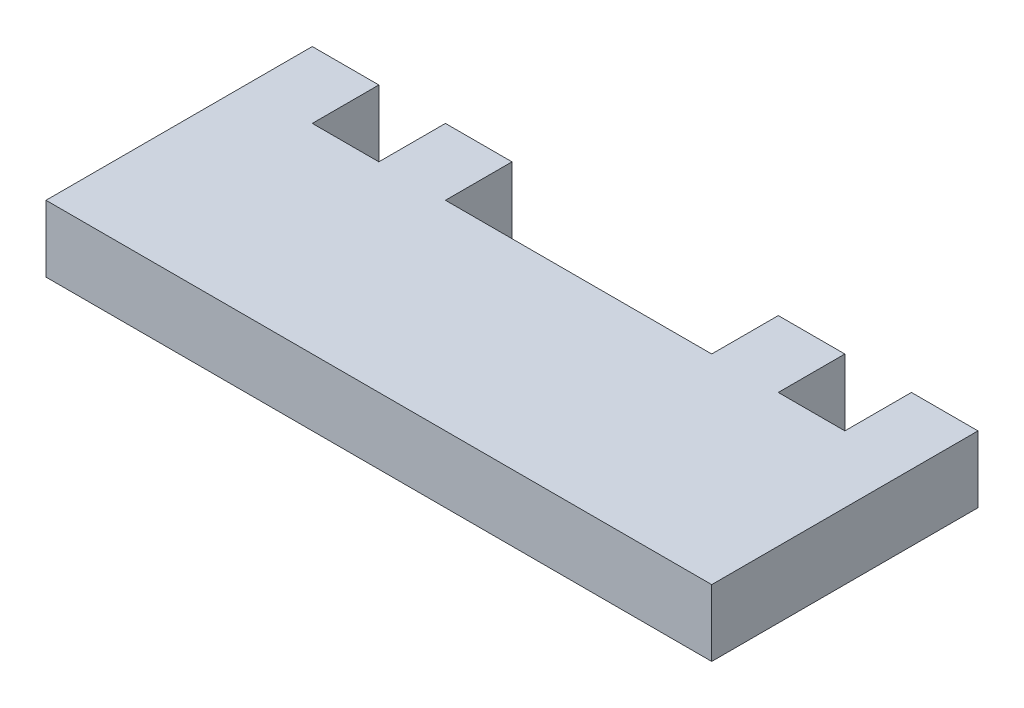
ISO-10303-21;
HEADER;
FILE_DESCRIPTION(('STEP AP214'),'2;1');
FILE_NAME('part.step','',(''),(''),'','','');
FILE_SCHEMA(('AUTOMOTIVE_DESIGN { 1 0 10303 214 1 1 1 1 }'));
ENDSEC;
DATA;
#1=APPLICATION_CONTEXT('core data for automotive mechanical design processes');
#2=APPLICATION_PROTOCOL_DEFINITION('international standard','automotive_design',2000,#1);
#3=PRODUCT_CONTEXT('',#1,'mechanical');
#4=PRODUCT('Part','Part','',(#3));
#5=PRODUCT_RELATED_PRODUCT_CATEGORY('part','',(#4));
#6=PRODUCT_DEFINITION_FORMATION('','',#4);
#7=PRODUCT_DEFINITION_CONTEXT('part definition',#1,'design');
#8=PRODUCT_DEFINITION('design','',#6,#7);
#9=PRODUCT_DEFINITION_SHAPE('','',#8);
#10=(LENGTH_UNIT() NAMED_UNIT(*) SI_UNIT(.MILLI.,.METRE.));
#11=(NAMED_UNIT(*) PLANE_ANGLE_UNIT() SI_UNIT($,.RADIAN.));
#12=(NAMED_UNIT(*) SI_UNIT($,.STERADIAN.) SOLID_ANGLE_UNIT());
#13=UNCERTAINTY_MEASURE_WITH_UNIT(LENGTH_MEASURE(1.E-05),#10,'distance_accuracy_value','');
#14=(GEOMETRIC_REPRESENTATION_CONTEXT(3) GLOBAL_UNCERTAINTY_ASSIGNED_CONTEXT((#13)) GLOBAL_UNIT_ASSIGNED_CONTEXT((#10,
#11,#12)) REPRESENTATION_CONTEXT('',''));
#15=CARTESIAN_POINT('',(0.,0.,0.));
#16=DIRECTION('',(0.,0.,1.));
#17=DIRECTION('',(1.,0.,0.));
#18=AXIS2_PLACEMENT_3D('',#15,#16,#17);
#19=CARTESIAN_POINT('',(0.,6.35,-6.34999999999999));
#20=DIRECTION('',(0.,0.,1.));
#21=DIRECTION('',(1.,0.,0.));
#22=AXIS2_PLACEMENT_3D('',#19,#20,#21);
#23=PLANE('',#22);
#24=DIRECTION('',(0.,-1.,0.));
#25=VECTOR('',#24,1.);
#26=CARTESIAN_POINT('',(-12.7,6.35,-6.34999999999999));
#27=LINE('',#26,#25);
#28=CARTESIAN_POINT('',(-12.7,6.35,-6.34999999999999));
#29=VERTEX_POINT('',#28);
#30=CARTESIAN_POINT('',(-12.7,0.,-6.34999999999999));
#31=VERTEX_POINT('',#30);
#32=EDGE_CURVE('E124',#29,#31,#27,.T.);
#33=ORIENTED_EDGE('',*,*,#32,.F.);
#34=DIRECTION('',(-1.,0.,0.));
#35=VECTOR('',#34,1.);
#36=CARTESIAN_POINT('',(0.,6.35,-6.34999999999999));
#37=LINE('',#36,#35);
#38=CARTESIAN_POINT('',(12.7,6.35,-6.34999999999999));
#39=VERTEX_POINT('',#38);
#40=EDGE_CURVE('E331',#39,#29,#37,.T.);
#41=ORIENTED_EDGE('',*,*,#40,.F.);
#42=DIRECTION('',(0.,-1.,0.));
#43=VECTOR('',#42,1.);
#44=CARTESIAN_POINT('',(12.7,6.35,-6.35000000000016));
#45=LINE('',#44,#43);
#46=CARTESIAN_POINT('',(12.7,0.,-6.34999999999999));
#47=VERTEX_POINT('',#46);
#48=EDGE_CURVE('E203',#39,#47,#45,.T.);
#49=ORIENTED_EDGE('',*,*,#48,.T.);
#50=DIRECTION('',(-1.,0.,0.));
#51=VECTOR('',#50,1.);
#52=CARTESIAN_POINT('',(0.,0.,-6.34999999999999));
#53=LINE('',#52,#51);
#54=EDGE_CURVE('E189',#47,#31,#53,.T.);
#55=ORIENTED_EDGE('',*,*,#54,.T.);
#56=EDGE_LOOP('',(#33,#41,#49,#55));
#57=FACE_BOUND('',#56,.T.);
#58=ADVANCED_FACE('F113',(#57),#23,.F.);
#59=CARTESIAN_POINT('',(-19.05,6.35,-6.34999999999999));
#60=VERTEX_POINT('',#59);
#61=CARTESIAN_POINT('',(-25.4,6.35,-6.34999999999999));
#62=VERTEX_POINT('',#61);
#63=EDGE_CURVE('E335',#60,#62,#37,.T.);
#64=ORIENTED_EDGE('',*,*,#63,.F.);
#65=DIRECTION('',(0.,-1.,0.));
#66=VECTOR('',#65,1.);
#67=CARTESIAN_POINT('',(-19.05,6.35,-6.34999999999999));
#68=LINE('',#67,#66);
#69=CARTESIAN_POINT('',(-19.05,0.,-6.34999999999999));
#70=VERTEX_POINT('',#69);
#71=EDGE_CURVE('E12',#60,#70,#68,.T.);
#72=ORIENTED_EDGE('',*,*,#71,.T.);
#73=CARTESIAN_POINT('',(-25.4,0.,-6.34999999999999));
#74=VERTEX_POINT('',#73);
#75=EDGE_CURVE('E251',#70,#74,#53,.T.);
#76=ORIENTED_EDGE('',*,*,#75,.T.);
#77=DIRECTION('',(0.,-1.,0.));
#78=VECTOR('',#77,1.);
#79=CARTESIAN_POINT('',(-25.4,6.35,-6.34999999999999));
#80=LINE('',#79,#78);
#81=EDGE_CURVE('E206',#62,#74,#80,.T.);
#82=ORIENTED_EDGE('',*,*,#81,.F.);
#83=EDGE_LOOP('',(#64,#72,#76,#82));
#84=FACE_BOUND('',#83,.T.);
#85=ADVANCED_FACE('F291',(#84),#23,.F.);
#86=CARTESIAN_POINT('',(-25.4,6.35,0.));
#87=DIRECTION('',(-1.,0.,0.));
#88=DIRECTION('',(0.,0.,1.));
#89=AXIS2_PLACEMENT_3D('',#86,#87,#88);
#90=PLANE('',#89);
#91=DIRECTION('',(0.,0.,-1.));
#92=VECTOR('',#91,1.);
#93=CARTESIAN_POINT('',(-25.4,0.,0.));
#94=LINE('',#93,#92);
#95=CARTESIAN_POINT('',(-25.4,0.,-12.7));
#96=VERTEX_POINT('',#95);
#97=EDGE_CURVE('E278',#74,#96,#94,.T.);
#98=ORIENTED_EDGE('',*,*,#97,.T.);
#99=DIRECTION('',(0.,-1.,0.));
#100=VECTOR('',#99,1.);
#101=CARTESIAN_POINT('',(-25.4,6.35,-12.7));
#102=LINE('',#101,#100);
#103=CARTESIAN_POINT('',(-25.4,6.35,-12.7));
#104=VERTEX_POINT('',#103);
#105=EDGE_CURVE('E211',#104,#96,#102,.T.);
#106=ORIENTED_EDGE('',*,*,#105,.F.);
#107=DIRECTION('',(0.,0.,-1.));
#108=VECTOR('',#107,1.);
#109=CARTESIAN_POINT('',(-25.4,6.35,0.));
#110=LINE('',#109,#108);
#111=EDGE_CURVE('E339',#62,#104,#110,.T.);
#112=ORIENTED_EDGE('',*,*,#111,.F.);
#113=ORIENTED_EDGE('',*,*,#81,.T.);
#114=EDGE_LOOP('',(#98,#106,#112,#113));
#115=FACE_BOUND('',#114,.T.);
#116=ADVANCED_FACE('F300',(#115),#90,.F.);
#117=CARTESIAN_POINT('',(0.,6.35,-12.7));
#118=DIRECTION('',(0.,0.,-1.));
#119=DIRECTION('',(-1.,0.,0.));
#120=AXIS2_PLACEMENT_3D('',#117,#118,#119);
#121=PLANE('',#120);
#122=DIRECTION('',(1.,0.,0.));
#123=VECTOR('',#122,1.);
#124=CARTESIAN_POINT('',(0.,0.,-12.7));
#125=LINE('',#124,#123);
#126=CARTESIAN_POINT('',(-31.75,0.,-12.7));
#127=VERTEX_POINT('',#126);
#128=EDGE_CURVE('E282',#127,#96,#125,.T.);
#129=ORIENTED_EDGE('',*,*,#128,.F.);
#130=DIRECTION('',(0.,-1.,0.));
#131=VECTOR('',#130,1.);
#132=CARTESIAN_POINT('',(-31.75,6.35,-12.7));
#133=LINE('',#132,#131);
#134=CARTESIAN_POINT('',(-31.75,6.35,-12.7));
#135=VERTEX_POINT('',#134);
#136=EDGE_CURVE('E219',#135,#127,#133,.T.);
#137=ORIENTED_EDGE('',*,*,#136,.F.);
#138=DIRECTION('',(1.,0.,0.));
#139=VECTOR('',#138,1.);
#140=CARTESIAN_POINT('',(0.,6.35,-12.7));
#141=LINE('',#140,#139);
#142=EDGE_CURVE('E346',#135,#104,#141,.T.);
#143=ORIENTED_EDGE('',*,*,#142,.T.);
#144=ORIENTED_EDGE('',*,*,#105,.T.);
#145=EDGE_LOOP('',(#129,#137,#143,#144));
#146=FACE_BOUND('',#145,.T.);
#147=ADVANCED_FACE('F432',(#146),#121,.T.);
#148=CARTESIAN_POINT('',(-31.75,6.35,0.));
#149=DIRECTION('',(-1.,0.,0.));
#150=DIRECTION('',(0.,0.,1.));
#151=AXIS2_PLACEMENT_3D('',#148,#149,#150);
#152=PLANE('',#151);
#153=DIRECTION('',(0.,0.,-1.));
#154=VECTOR('',#153,1.);
#155=CARTESIAN_POINT('',(-31.75,0.,0.));
#156=LINE('',#155,#154);
#157=CARTESIAN_POINT('',(-31.75,0.,12.7));
#158=VERTEX_POINT('',#157);
#159=EDGE_CURVE('E581',#158,#127,#156,.T.);
#160=ORIENTED_EDGE('',*,*,#159,.F.);
#161=DIRECTION('',(0.,-1.,0.));
#162=VECTOR('',#161,1.);
#163=CARTESIAN_POINT('',(-31.75,6.35,12.7));
#164=LINE('',#163,#162);
#165=CARTESIAN_POINT('',(-31.75,6.35,12.7));
#166=VERTEX_POINT('',#165);
#167=EDGE_CURVE('E606',#166,#158,#164,.T.);
#168=ORIENTED_EDGE('',*,*,#167,.F.);
#169=DIRECTION('',(0.,0.,-1.));
#170=VECTOR('',#169,1.);
#171=CARTESIAN_POINT('',(-31.75,6.35,0.));
#172=LINE('',#171,#170);
#173=EDGE_CURVE('E349',#166,#135,#172,.T.);
#174=ORIENTED_EDGE('',*,*,#173,.T.);
#175=ORIENTED_EDGE('',*,*,#136,.T.);
#176=EDGE_LOOP('',(#160,#168,#174,#175));
#177=FACE_BOUND('',#176,.T.);
#178=ADVANCED_FACE('F439',(#177),#152,.T.);
#179=CARTESIAN_POINT('',(0.,6.35,12.7));
#180=DIRECTION('',(0.,0.,-1.));
#181=DIRECTION('',(-1.,0.,0.));
#182=AXIS2_PLACEMENT_3D('',#179,#180,#181);
#183=PLANE('',#182);
#184=DIRECTION('',(1.,0.,0.));
#185=VECTOR('',#184,1.);
#186=CARTESIAN_POINT('',(0.,0.,12.7));
#187=LINE('',#186,#185);
#188=CARTESIAN_POINT('',(31.75,0.,12.7));
#189=VERTEX_POINT('',#188);
#190=EDGE_CURVE('E587',#158,#189,#187,.T.);
#191=ORIENTED_EDGE('',*,*,#190,.T.);
#192=DIRECTION('',(0.,-1.,0.));
#193=VECTOR('',#192,1.);
#194=CARTESIAN_POINT('',(31.75,6.35,12.7));
#195=LINE('',#194,#193);
#196=CARTESIAN_POINT('',(31.75,6.35,12.7));
#197=VERTEX_POINT('',#196);
#198=EDGE_CURVE('E602',#197,#189,#195,.T.);
#199=ORIENTED_EDGE('',*,*,#198,.F.);
#200=DIRECTION('',(1.,0.,0.));
#201=VECTOR('',#200,1.);
#202=CARTESIAN_POINT('',(0.,6.35,12.7));
#203=LINE('',#202,#201);
#204=EDGE_CURVE('E354',#166,#197,#203,.T.);
#205=ORIENTED_EDGE('',*,*,#204,.F.);
#206=ORIENTED_EDGE('',*,*,#167,.T.);
#207=EDGE_LOOP('',(#191,#199,#205,#206));
#208=FACE_BOUND('',#207,.T.);
#209=ADVANCED_FACE('F435',(#208),#183,.F.);
#210=CARTESIAN_POINT('',(31.75,6.35,0.));
#211=DIRECTION('',(-1.,0.,0.));
#212=DIRECTION('',(0.,0.,1.));
#213=AXIS2_PLACEMENT_3D('',#210,#211,#212);
#214=PLANE('',#213);
#215=DIRECTION('',(0.,0.,-1.));
#216=VECTOR('',#215,1.);
#217=CARTESIAN_POINT('',(31.75,0.,0.));
#218=LINE('',#217,#216);
#219=CARTESIAN_POINT('',(31.75,0.,-12.7));
#220=VERTEX_POINT('',#219);
#221=EDGE_CURVE('E591',#189,#220,#218,.T.);
#222=ORIENTED_EDGE('',*,*,#221,.T.);
#223=DIRECTION('',(0.,-1.,0.));
#224=VECTOR('',#223,1.);
#225=CARTESIAN_POINT('',(31.75,6.35,-12.7));
#226=LINE('',#225,#224);
#227=CARTESIAN_POINT('',(31.75,6.35,-12.7));
#228=VERTEX_POINT('',#227);
#229=EDGE_CURVE('E379',#228,#220,#226,.T.);
#230=ORIENTED_EDGE('',*,*,#229,.F.);
#231=DIRECTION('',(0.,0.,-1.));
#232=VECTOR('',#231,1.);
#233=CARTESIAN_POINT('',(31.75,6.35,0.));
#234=LINE('',#233,#232);
#235=EDGE_CURVE('E358',#197,#228,#234,.T.);
#236=ORIENTED_EDGE('',*,*,#235,.F.);
#237=ORIENTED_EDGE('',*,*,#198,.T.);
#238=EDGE_LOOP('',(#222,#230,#236,#237));
#239=FACE_BOUND('',#238,.T.);
#240=ADVANCED_FACE('F431',(#239),#214,.F.);
#241=CARTESIAN_POINT('',(25.4,0.,-12.7));
#242=VERTEX_POINT('',#241);
#243=EDGE_CURVE('E583',#242,#220,#125,.T.);
#244=ORIENTED_EDGE('',*,*,#243,.F.);
#245=DIRECTION('',(0.,-1.,0.));
#246=VECTOR('',#245,1.);
#247=CARTESIAN_POINT('',(25.4,6.35,-12.7));
#248=LINE('',#247,#246);
#249=CARTESIAN_POINT('',(25.4,6.35,-12.7));
#250=VERTEX_POINT('',#249);
#251=EDGE_CURVE('E369',#250,#242,#248,.T.);
#252=ORIENTED_EDGE('',*,*,#251,.F.);
#253=EDGE_CURVE('E350',#250,#228,#141,.T.);
#254=ORIENTED_EDGE('',*,*,#253,.T.);
#255=ORIENTED_EDGE('',*,*,#229,.T.);
#256=EDGE_LOOP('',(#244,#252,#254,#255));
#257=FACE_BOUND('',#256,.T.);
#258=ADVANCED_FACE('F377',(#257),#121,.T.);
#259=CARTESIAN_POINT('',(25.4,6.35,0.));
#260=DIRECTION('',(-1.,0.,0.));
#261=DIRECTION('',(0.,0.,1.));
#262=AXIS2_PLACEMENT_3D('',#259,#260,#261);
#263=PLANE('',#262);
#264=DIRECTION('',(0.,0.,-1.));
#265=VECTOR('',#264,1.);
#266=CARTESIAN_POINT('',(25.4,0.,0.));
#267=LINE('',#266,#265);
#268=CARTESIAN_POINT('',(25.4,0.,-6.34999999999999));
#269=VERTEX_POINT('',#268);
#270=EDGE_CURVE('E341',#269,#242,#267,.T.);
#271=ORIENTED_EDGE('',*,*,#270,.F.);
#272=DIRECTION('',(0.,-1.,0.));
#273=VECTOR('',#272,1.);
#274=CARTESIAN_POINT('',(25.4,6.35,-6.34999999999999));
#275=LINE('',#274,#273);
#276=CARTESIAN_POINT('',(25.4,6.35,-6.34999999999999));
#277=VERTEX_POINT('',#276);
#278=EDGE_CURVE('E276',#277,#269,#275,.T.);
#279=ORIENTED_EDGE('',*,*,#278,.F.);
#280=DIRECTION('',(0.,0.,-1.));
#281=VECTOR('',#280,1.);
#282=CARTESIAN_POINT('',(25.4,6.35,0.));
#283=LINE('',#282,#281);
#284=EDGE_CURVE('E361',#277,#250,#283,.T.);
#285=ORIENTED_EDGE('',*,*,#284,.T.);
#286=ORIENTED_EDGE('',*,*,#251,.T.);
#287=EDGE_LOOP('',(#271,#279,#285,#286));
#288=FACE_BOUND('',#287,.T.);
#289=ADVANCED_FACE('F426',(#288),#263,.T.);
#290=DIRECTION('',(0.,-1.,0.));
#291=VECTOR('',#290,1.);
#292=CARTESIAN_POINT('',(19.05,6.35,-6.35000000000025));
#293=LINE('',#292,#291);
#294=CARTESIAN_POINT('',(19.05,6.35,-6.34999999999999));
#295=VERTEX_POINT('',#294);
#296=CARTESIAN_POINT('',(19.05,0.,-6.34999999999999));
#297=VERTEX_POINT('',#296);
#298=EDGE_CURVE('E199',#295,#297,#293,.T.);
#299=ORIENTED_EDGE('',*,*,#298,.F.);
#300=EDGE_CURVE('E334',#277,#295,#37,.T.);
#301=ORIENTED_EDGE('',*,*,#300,.F.);
#302=ORIENTED_EDGE('',*,*,#278,.T.);
#303=EDGE_CURVE('E266',#269,#297,#53,.T.);
#304=ORIENTED_EDGE('',*,*,#303,.T.);
#305=EDGE_LOOP('',(#299,#301,#302,#304));
#306=FACE_BOUND('',#305,.T.);
#307=ADVANCED_FACE('F272',(#306),#23,.F.);
#308=CARTESIAN_POINT('',(0.,0.,0.));
#309=DIRECTION('',(0.,1.,0.));
#310=DIRECTION('',(0.,0.,1.));
#311=AXIS2_PLACEMENT_3D('',#308,#309,#310);
#312=PLANE('',#311);
#313=ORIENTED_EDGE('',*,*,#303,.F.);
#314=ORIENTED_EDGE('',*,*,#270,.T.);
#315=ORIENTED_EDGE('',*,*,#243,.T.);
#316=ORIENTED_EDGE('',*,*,#221,.F.);
#317=ORIENTED_EDGE('',*,*,#190,.F.);
#318=ORIENTED_EDGE('',*,*,#159,.T.);
#319=ORIENTED_EDGE('',*,*,#128,.T.);
#320=ORIENTED_EDGE('',*,*,#97,.F.);
#321=ORIENTED_EDGE('',*,*,#75,.F.);
#322=DIRECTION('',(0.,0.,-1.));
#323=VECTOR('',#322,1.);
#324=CARTESIAN_POINT('',(-19.05,0.,-6.34999999999999));
#325=LINE('',#324,#323);
#326=CARTESIAN_POINT('',(-19.05,0.,-12.7));
#327=VERTEX_POINT('',#326);
#328=EDGE_CURVE('E231',#70,#327,#325,.T.);
#329=ORIENTED_EDGE('',*,*,#328,.T.);
#330=DIRECTION('',(1.,0.,0.));
#331=VECTOR('',#330,1.);
#332=CARTESIAN_POINT('',(-19.05,0.,-12.7));
#333=LINE('',#332,#331);
#334=CARTESIAN_POINT('',(-12.7,0.,-12.7));
#335=VERTEX_POINT('',#334);
#336=EDGE_CURVE('E238',#327,#335,#333,.T.);
#337=ORIENTED_EDGE('',*,*,#336,.T.);
#338=DIRECTION('',(0.,0.,-1.));
#339=VECTOR('',#338,1.);
#340=CARTESIAN_POINT('',(-12.7,0.,-6.34999999999999));
#341=LINE('',#340,#339);
#342=EDGE_CURVE('E242',#31,#335,#341,.T.);
#343=ORIENTED_EDGE('',*,*,#342,.F.);
#344=ORIENTED_EDGE('',*,*,#54,.F.);
#345=DIRECTION('',(0.,0.,-1.));
#346=VECTOR('',#345,1.);
#347=CARTESIAN_POINT('',(12.7,0.,-6.35000000000016));
#348=LINE('',#347,#346);
#349=CARTESIAN_POINT('',(12.7,0.,-12.7000000000002));
#350=VERTEX_POINT('',#349);
#351=EDGE_CURVE('E173',#47,#350,#348,.T.);
#352=ORIENTED_EDGE('',*,*,#351,.T.);
#353=DIRECTION('',(-1.,0.,0.));
#354=VECTOR('',#353,1.);
#355=CARTESIAN_POINT('',(19.05,0.,-12.7000000000002));
#356=LINE('',#355,#354);
#357=CARTESIAN_POINT('',(19.05,0.,-12.7000000000002));
#358=VERTEX_POINT('',#357);
#359=EDGE_CURVE('E162',#358,#350,#356,.T.);
#360=ORIENTED_EDGE('',*,*,#359,.F.);
#361=DIRECTION('',(0.,0.,-1.));
#362=VECTOR('',#361,1.);
#363=CARTESIAN_POINT('',(19.05,0.,-6.35000000000025));
#364=LINE('',#363,#362);
#365=EDGE_CURVE('E183',#297,#358,#364,.T.);
#366=ORIENTED_EDGE('',*,*,#365,.F.);
#367=EDGE_LOOP('',(#313,#314,#315,#316,#317,#318,#319,#320,#321,#329,#337,#343,#344,#352,#360,#366));
#368=FACE_BOUND('',#367,.T.);
#369=ADVANCED_FACE('F186',(#368),#312,.F.);
#370=CARTESIAN_POINT('',(0.,6.35,0.));
#371=DIRECTION('',(0.,1.,0.));
#372=DIRECTION('',(0.,0.,1.));
#373=AXIS2_PLACEMENT_3D('',#370,#371,#372);
#374=PLANE('',#373);
#375=ORIENTED_EDGE('',*,*,#300,.T.);
#376=DIRECTION('',(0.,0.,-1.));
#377=VECTOR('',#376,1.);
#378=CARTESIAN_POINT('',(19.05,6.35,-6.35000000000025));
#379=LINE('',#378,#377);
#380=CARTESIAN_POINT('',(19.05,6.35,-12.7000000000002));
#381=VERTEX_POINT('',#380);
#382=EDGE_CURVE('E191',#295,#381,#379,.T.);
#383=ORIENTED_EDGE('',*,*,#382,.T.);
#384=DIRECTION('',(-1.,0.,0.));
#385=VECTOR('',#384,1.);
#386=CARTESIAN_POINT('',(19.05,6.35,-12.7000000000002));
#387=LINE('',#386,#385);
#388=CARTESIAN_POINT('',(12.7,6.35,-12.7000000000002));
#389=VERTEX_POINT('',#388);
#390=EDGE_CURVE('E195',#381,#389,#387,.T.);
#391=ORIENTED_EDGE('',*,*,#390,.T.);
#392=DIRECTION('',(0.,0.,-1.));
#393=VECTOR('',#392,1.);
#394=CARTESIAN_POINT('',(12.7,6.35,-6.35000000000016));
#395=LINE('',#394,#393);
#396=EDGE_CURVE('E176',#39,#389,#395,.T.);
#397=ORIENTED_EDGE('',*,*,#396,.F.);
#398=ORIENTED_EDGE('',*,*,#40,.T.);
#399=DIRECTION('',(0.,0.,-1.));
#400=VECTOR('',#399,1.);
#401=CARTESIAN_POINT('',(-12.7,6.35,-6.34999999999999));
#402=LINE('',#401,#400);
#403=CARTESIAN_POINT('',(-12.7,6.35,-12.7));
#404=VERTEX_POINT('',#403);
#405=EDGE_CURVE('E230',#29,#404,#402,.T.);
#406=ORIENTED_EDGE('',*,*,#405,.T.);
#407=DIRECTION('',(1.,0.,0.));
#408=VECTOR('',#407,1.);
#409=CARTESIAN_POINT('',(-19.05,6.35,-12.7));
#410=LINE('',#409,#408);
#411=CARTESIAN_POINT('',(-19.05,6.35,-12.7));
#412=VERTEX_POINT('',#411);
#413=EDGE_CURVE('E226',#412,#404,#410,.T.);
#414=ORIENTED_EDGE('',*,*,#413,.F.);
#415=DIRECTION('',(0.,0.,-1.));
#416=VECTOR('',#415,1.);
#417=CARTESIAN_POINT('',(-19.05,6.35,-6.34999999999999));
#418=LINE('',#417,#416);
#419=EDGE_CURVE('E234',#60,#412,#418,.T.);
#420=ORIENTED_EDGE('',*,*,#419,.F.);
#421=ORIENTED_EDGE('',*,*,#63,.T.);
#422=ORIENTED_EDGE('',*,*,#111,.T.);
#423=ORIENTED_EDGE('',*,*,#142,.F.);
#424=ORIENTED_EDGE('',*,*,#173,.F.);
#425=ORIENTED_EDGE('',*,*,#204,.T.);
#426=ORIENTED_EDGE('',*,*,#235,.T.);
#427=ORIENTED_EDGE('',*,*,#253,.F.);
#428=ORIENTED_EDGE('',*,*,#284,.F.);
#429=EDGE_LOOP('',(#375,#383,#391,#397,#398,#406,#414,#420,#421,#422,#423,#424,#425,#426,#427,#428));
#430=FACE_BOUND('',#429,.T.);
#431=ADVANCED_FACE('F330',(#430),#374,.T.);
#432=CARTESIAN_POINT('',(19.05,6.35,-12.7000000000002));
#433=DIRECTION('',(0.,0.,1.));
#434=DIRECTION('',(1.,0.,0.));
#435=AXIS2_PLACEMENT_3D('',#432,#433,#434);
#436=PLANE('',#435);
#437=ORIENTED_EDGE('',*,*,#359,.T.);
#438=DIRECTION('',(0.,-1.,0.));
#439=VECTOR('',#438,1.);
#440=CARTESIAN_POINT('',(12.7,6.35,-12.7000000000002));
#441=LINE('',#440,#439);
#442=EDGE_CURVE('E169',#389,#350,#441,.T.);
#443=ORIENTED_EDGE('',*,*,#442,.F.);
#444=ORIENTED_EDGE('',*,*,#390,.F.);
#445=DIRECTION('',(0.,-1.,0.));
#446=VECTOR('',#445,1.);
#447=CARTESIAN_POINT('',(19.05,6.35,-12.7000000000002));
#448=LINE('',#447,#446);
#449=EDGE_CURVE('E117',#381,#358,#448,.T.);
#450=ORIENTED_EDGE('',*,*,#449,.T.);
#451=EDGE_LOOP('',(#437,#443,#444,#450));
#452=FACE_BOUND('',#451,.T.);
#453=ADVANCED_FACE('F179',(#452),#436,.F.);
#454=CARTESIAN_POINT('',(12.7,6.35,-6.35000000000016));
#455=DIRECTION('',(-1.,0.,0.));
#456=DIRECTION('',(0.,0.,1.));
#457=AXIS2_PLACEMENT_3D('',#454,#455,#456);
#458=PLANE('',#457);
#459=ORIENTED_EDGE('',*,*,#351,.F.);
#460=ORIENTED_EDGE('',*,*,#48,.F.);
#461=ORIENTED_EDGE('',*,*,#396,.T.);
#462=ORIENTED_EDGE('',*,*,#442,.T.);
#463=EDGE_LOOP('',(#459,#460,#461,#462));
#464=FACE_BOUND('',#463,.T.);
#465=ADVANCED_FACE('F170',(#464),#458,.T.);
#466=CARTESIAN_POINT('',(19.05,6.35,-6.35000000000025));
#467=DIRECTION('',(-1.,0.,0.));
#468=DIRECTION('',(0.,0.,1.));
#469=AXIS2_PLACEMENT_3D('',#466,#467,#468);
#470=PLANE('',#469);
#471=ORIENTED_EDGE('',*,*,#365,.T.);
#472=ORIENTED_EDGE('',*,*,#449,.F.);
#473=ORIENTED_EDGE('',*,*,#382,.F.);
#474=ORIENTED_EDGE('',*,*,#298,.T.);
#475=EDGE_LOOP('',(#471,#472,#473,#474));
#476=FACE_BOUND('',#475,.T.);
#477=ADVANCED_FACE('F115',(#476),#470,.F.);
#478=CARTESIAN_POINT('',(-19.05,6.35,-6.34999999999999));
#479=DIRECTION('',(-1.,0.,0.));
#480=DIRECTION('',(0.,0.,1.));
#481=AXIS2_PLACEMENT_3D('',#478,#479,#480);
#482=PLANE('',#481);
#483=ORIENTED_EDGE('',*,*,#328,.F.);
#484=ORIENTED_EDGE('',*,*,#71,.F.);
#485=ORIENTED_EDGE('',*,*,#419,.T.);
#486=DIRECTION('',(0.,-1.,0.));
#487=VECTOR('',#486,1.);
#488=CARTESIAN_POINT('',(-19.05,6.35,-12.7));
#489=LINE('',#488,#487);
#490=EDGE_CURVE('E249',#412,#327,#489,.T.);
#491=ORIENTED_EDGE('',*,*,#490,.T.);
#492=EDGE_LOOP('',(#483,#484,#485,#491));
#493=FACE_BOUND('',#492,.T.);
#494=ADVANCED_FACE('F396',(#493),#482,.T.);
#495=CARTESIAN_POINT('',(-12.7,6.35,-6.34999999999999));
#496=DIRECTION('',(-1.,0.,0.));
#497=DIRECTION('',(0.,0.,1.));
#498=AXIS2_PLACEMENT_3D('',#495,#496,#497);
#499=PLANE('',#498);
#500=ORIENTED_EDGE('',*,*,#342,.T.);
#501=DIRECTION('',(0.,-1.,0.));
#502=VECTOR('',#501,1.);
#503=CARTESIAN_POINT('',(-12.7,6.35,-12.7));
#504=LINE('',#503,#502);
#505=EDGE_CURVE('E237',#404,#335,#504,.T.);
#506=ORIENTED_EDGE('',*,*,#505,.F.);
#507=ORIENTED_EDGE('',*,*,#405,.F.);
#508=ORIENTED_EDGE('',*,*,#32,.T.);
#509=EDGE_LOOP('',(#500,#506,#507,#508));
#510=FACE_BOUND('',#509,.T.);
#511=ADVANCED_FACE('F402',(#510),#499,.F.);
#512=CARTESIAN_POINT('',(-19.05,6.35,-12.7));
#513=DIRECTION('',(0.,0.,-1.));
#514=DIRECTION('',(-1.,0.,0.));
#515=AXIS2_PLACEMENT_3D('',#512,#513,#514);
#516=PLANE('',#515);
#517=ORIENTED_EDGE('',*,*,#336,.F.);
#518=ORIENTED_EDGE('',*,*,#490,.F.);
#519=ORIENTED_EDGE('',*,*,#413,.T.);
#520=ORIENTED_EDGE('',*,*,#505,.T.);
#521=EDGE_LOOP('',(#517,#518,#519,#520));
#522=FACE_BOUND('',#521,.T.);
#523=ADVANCED_FACE('F399',(#522),#516,.T.);
#524=CLOSED_SHELL('',(#58,#85,#116,#147,#178,#209,#240,#258,#289,#307,#369,#431,#453,#465,#477,
#494,#511,#523));
#525=MANIFOLD_SOLID_BREP('B2',#524);
#526=ADVANCED_BREP_SHAPE_REPRESENTATION('',(#18,#525),#14);
#527=SHAPE_DEFINITION_REPRESENTATION(#9,#526);
ENDSEC;
END-ISO-10303-21;
